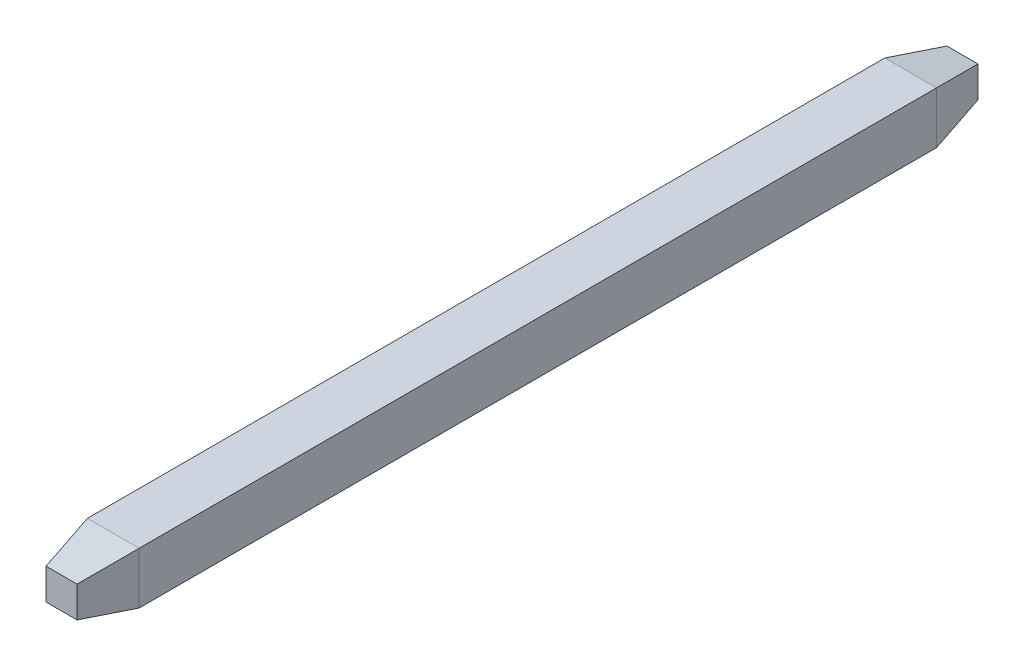
ISO-10303-21;
HEADER;
FILE_DESCRIPTION(('STEP AP214'),'2;1');
FILE_NAME('part.step','',(''),(''),'','','');
FILE_SCHEMA(('AUTOMOTIVE_DESIGN { 1 0 10303 214 1 1 1 1 }'));
ENDSEC;
DATA;
#1=APPLICATION_CONTEXT('core data for automotive mechanical design processes');
#2=APPLICATION_PROTOCOL_DEFINITION('international standard','automotive_design',2000,#1);
#3=PRODUCT_CONTEXT('',#1,'mechanical');
#4=PRODUCT('Part','Part','',(#3));
#5=PRODUCT_RELATED_PRODUCT_CATEGORY('part','',(#4));
#6=PRODUCT_DEFINITION_FORMATION('','',#4);
#7=PRODUCT_DEFINITION_CONTEXT('part definition',#1,'design');
#8=PRODUCT_DEFINITION('design','',#6,#7);
#9=PRODUCT_DEFINITION_SHAPE('','',#8);
#10=(LENGTH_UNIT() NAMED_UNIT(*) SI_UNIT(.MILLI.,.METRE.));
#11=(NAMED_UNIT(*) PLANE_ANGLE_UNIT() SI_UNIT($,.RADIAN.));
#12=(NAMED_UNIT(*) SI_UNIT($,.STERADIAN.) SOLID_ANGLE_UNIT());
#13=UNCERTAINTY_MEASURE_WITH_UNIT(LENGTH_MEASURE(1.E-05),#10,'distance_accuracy_value','');
#14=(GEOMETRIC_REPRESENTATION_CONTEXT(3) GLOBAL_UNCERTAINTY_ASSIGNED_CONTEXT((#13)) GLOBAL_UNIT_ASSIGNED_CONTEXT((#10,
#11,#12)) REPRESENTATION_CONTEXT('',''));
#15=CARTESIAN_POINT('',(0.,0.,0.));
#16=DIRECTION('',(0.,0.,1.));
#17=DIRECTION('',(1.,0.,0.));
#18=AXIS2_PLACEMENT_3D('',#15,#16,#17);
#19=CARTESIAN_POINT('',(4.84,144.16,6.01));
#20=DIRECTION('',(0.,0.,1.));
#21=DIRECTION('',(1.,0.,0.));
#22=AXIS2_PLACEMENT_3D('',#19,#20,#21);
#23=PLANE('',#22);
#24=CARTESIAN_POINT('',(4.15,145.15,6.01));
#25=CARTESIAN_POINT('',(4.15,144.85,6.01));
#26=B_SPLINE_CURVE_WITH_KNOTS('',1,(#24,#25),.UNSPECIFIED.,.F.,.F.,(2,2),(-0.3,0.),.UNSPECIFIED.);
#27=CARTESIAN_POINT('',(4.15,145.15,6.01));
#28=VERTEX_POINT('',#27);
#29=CARTESIAN_POINT('',(4.15,144.85,6.01));
#30=VERTEX_POINT('',#29);
#31=EDGE_CURVE('E11',#28,#30,#26,.T.);
#32=ORIENTED_EDGE('',*,*,#31,.F.);
#33=CARTESIAN_POINT('',(3.85,145.15,6.01));
#34=CARTESIAN_POINT('',(4.15,145.15,6.01));
#35=B_SPLINE_CURVE_WITH_KNOTS('',1,(#33,#34),.UNSPECIFIED.,.F.,.F.,(2,2),(-0.3,0.),.UNSPECIFIED.);
#36=CARTESIAN_POINT('',(3.85,145.15,6.01));
#37=VERTEX_POINT('',#36);
#38=EDGE_CURVE('E26',#37,#28,#35,.T.);
#39=ORIENTED_EDGE('',*,*,#38,.F.);
#40=CARTESIAN_POINT('',(3.85,144.85,6.01));
#41=CARTESIAN_POINT('',(3.85,145.15,6.01));
#42=B_SPLINE_CURVE_WITH_KNOTS('',1,(#40,#41),.UNSPECIFIED.,.F.,.F.,(2,2),(-0.3,0.),.UNSPECIFIED.);
#43=CARTESIAN_POINT('',(3.85,144.85,6.01));
#44=VERTEX_POINT('',#43);
#45=EDGE_CURVE('E263',#44,#37,#42,.T.);
#46=ORIENTED_EDGE('',*,*,#45,.F.);
#47=CARTESIAN_POINT('',(4.15,144.85,6.01));
#48=CARTESIAN_POINT('',(3.85,144.85,6.01));
#49=B_SPLINE_CURVE_WITH_KNOTS('',1,(#47,#48),.UNSPECIFIED.,.F.,.F.,(2,2),(-0.3,0.),.UNSPECIFIED.);
#50=EDGE_CURVE('E255',#30,#44,#49,.T.);
#51=ORIENTED_EDGE('',*,*,#50,.F.);
#52=EDGE_LOOP('',(#32,#39,#46,#51));
#53=FACE_BOUND('',#52,.T.);
#54=ADVANCED_FACE('F17',(#53),#23,.T.);
#55=CARTESIAN_POINT('',(3.75,144.04,6.34));
#56=DIRECTION('',(-1.,0.,0.));
#57=DIRECTION('',(0.,0.,-1.));
#58=AXIS2_PLACEMENT_3D('',#55,#56,#57);
#59=PLANE('',#58);
#60=CARTESIAN_POINT('',(3.75,145.25,5.51));
#61=CARTESIAN_POINT('',(3.75,144.75,5.51));
#62=B_SPLINE_CURVE_WITH_KNOTS('',1,(#60,#61),.UNSPECIFIED.,.F.,.F.,(2,2),(-0.5,0.),.UNSPECIFIED.);
#63=CARTESIAN_POINT('',(3.75,145.25,5.51));
#64=VERTEX_POINT('',#63);
#65=CARTESIAN_POINT('',(3.75,144.75,5.51));
#66=VERTEX_POINT('',#65);
#67=EDGE_CURVE('E248',#64,#66,#62,.T.);
#68=ORIENTED_EDGE('',*,*,#67,.F.);
#69=CARTESIAN_POINT('',(3.75,145.25,-2.19));
#70=CARTESIAN_POINT('',(3.75,145.25,5.51));
#71=B_SPLINE_CURVE_WITH_KNOTS('',1,(#69,#70),.UNSPECIFIED.,.F.,.F.,(2,2),(-7.7,0.),.UNSPECIFIED.);
#72=CARTESIAN_POINT('',(3.75,145.25,-2.19));
#73=VERTEX_POINT('',#72);
#74=EDGE_CURVE('E241',#73,#64,#71,.T.);
#75=ORIENTED_EDGE('',*,*,#74,.F.);
#76=CARTESIAN_POINT('',(3.75,144.75,-2.19));
#77=CARTESIAN_POINT('',(3.75,145.25,-2.19));
#78=B_SPLINE_CURVE_WITH_KNOTS('',1,(#76,#77),.UNSPECIFIED.,.F.,.F.,(2,2),(-0.5,0.),.UNSPECIFIED.);
#79=CARTESIAN_POINT('',(3.75,144.75,-2.19));
#80=VERTEX_POINT('',#79);
#81=EDGE_CURVE('E233',#80,#73,#78,.T.);
#82=ORIENTED_EDGE('',*,*,#81,.F.);
#83=CARTESIAN_POINT('',(3.75,144.75,5.51));
#84=CARTESIAN_POINT('',(3.75,144.75,-2.19));
#85=B_SPLINE_CURVE_WITH_KNOTS('',1,(#83,#84),.UNSPECIFIED.,.F.,.F.,(2,2),(-7.7,0.),.UNSPECIFIED.);
#86=EDGE_CURVE('E225',#66,#80,#85,.T.);
#87=ORIENTED_EDGE('',*,*,#86,.F.);
#88=EDGE_LOOP('',(#68,#75,#82,#87));
#89=FACE_BOUND('',#88,.T.);
#90=ADVANCED_FACE('F319',(#89),#59,.T.);
#91=CARTESIAN_POINT('',(3.16,144.16,-2.69));
#92=DIRECTION('',(0.,0.,-1.));
#93=DIRECTION('',(-1.,0.,0.));
#94=AXIS2_PLACEMENT_3D('',#91,#92,#93);
#95=PLANE('',#94);
#96=CARTESIAN_POINT('',(4.15,144.85,-2.69));
#97=CARTESIAN_POINT('',(4.15,145.15,-2.69));
#98=B_SPLINE_CURVE_WITH_KNOTS('',1,(#96,#97),.UNSPECIFIED.,.F.,.F.,(2,2),(-0.3,0.),.UNSPECIFIED.);
#99=CARTESIAN_POINT('',(4.15,144.85,-2.69));
#100=VERTEX_POINT('',#99);
#101=CARTESIAN_POINT('',(4.15,145.15,-2.69));
#102=VERTEX_POINT('',#101);
#103=EDGE_CURVE('E114',#100,#102,#98,.T.);
#104=ORIENTED_EDGE('',*,*,#103,.F.);
#105=CARTESIAN_POINT('',(3.85,144.85,-2.69));
#106=CARTESIAN_POINT('',(4.15,144.85,-2.69));
#107=B_SPLINE_CURVE_WITH_KNOTS('',1,(#105,#106),.UNSPECIFIED.,.F.,.F.,(2,2),(-0.3,0.),.UNSPECIFIED.);
#108=CARTESIAN_POINT('',(3.85,144.85,-2.69));
#109=VERTEX_POINT('',#108);
#110=EDGE_CURVE('E211',#109,#100,#107,.T.);
#111=ORIENTED_EDGE('',*,*,#110,.F.);
#112=CARTESIAN_POINT('',(3.85,145.15,-2.69));
#113=CARTESIAN_POINT('',(3.85,144.85,-2.69));
#114=B_SPLINE_CURVE_WITH_KNOTS('',1,(#112,#113),.UNSPECIFIED.,.F.,.F.,(2,2),(-0.3,0.),.UNSPECIFIED.);
#115=CARTESIAN_POINT('',(3.85,145.15,-2.69));
#116=VERTEX_POINT('',#115);
#117=EDGE_CURVE('E203',#116,#109,#114,.T.);
#118=ORIENTED_EDGE('',*,*,#117,.F.);
#119=CARTESIAN_POINT('',(4.15,145.15,-2.69));
#120=CARTESIAN_POINT('',(3.85,145.15,-2.69));
#121=B_SPLINE_CURVE_WITH_KNOTS('',1,(#119,#120),.UNSPECIFIED.,.F.,.F.,(2,2),(-0.3,0.),.UNSPECIFIED.);
#122=EDGE_CURVE('E196',#102,#116,#121,.T.);
#123=ORIENTED_EDGE('',*,*,#122,.F.);
#124=EDGE_LOOP('',(#104,#111,#118,#123));
#125=FACE_BOUND('',#124,.T.);
#126=ADVANCED_FACE('F315',(#125),#95,.T.);
#127=CARTESIAN_POINT('',(4.25,144.04,-3.02));
#128=DIRECTION('',(1.,0.,0.));
#129=DIRECTION('',(0.,0.,1.));
#130=AXIS2_PLACEMENT_3D('',#127,#128,#129);
#131=PLANE('',#130);
#132=CARTESIAN_POINT('',(4.25,144.75,5.51));
#133=CARTESIAN_POINT('',(4.25,145.25,5.51));
#134=B_SPLINE_CURVE_WITH_KNOTS('',1,(#132,#133),.UNSPECIFIED.,.F.,.F.,(2,2),(-0.5,0.),.UNSPECIFIED.);
#135=CARTESIAN_POINT('',(4.25,144.75,5.51));
#136=VERTEX_POINT('',#135);
#137=CARTESIAN_POINT('',(4.25,145.25,5.51));
#138=VERTEX_POINT('',#137);
#139=EDGE_CURVE('E189',#136,#138,#134,.T.);
#140=ORIENTED_EDGE('',*,*,#139,.F.);
#141=CARTESIAN_POINT('',(4.25,144.75,-2.19));
#142=CARTESIAN_POINT('',(4.25,144.75,5.51));
#143=B_SPLINE_CURVE_WITH_KNOTS('',1,(#141,#142),.UNSPECIFIED.,.F.,.F.,(2,2),(-7.7,0.),.UNSPECIFIED.);
#144=CARTESIAN_POINT('',(4.25,144.75,-2.19));
#145=VERTEX_POINT('',#144);
#146=EDGE_CURVE('E86',#145,#136,#143,.T.);
#147=ORIENTED_EDGE('',*,*,#146,.F.);
#148=CARTESIAN_POINT('',(4.25,145.25,-2.19));
#149=CARTESIAN_POINT('',(4.25,144.75,-2.19));
#150=B_SPLINE_CURVE_WITH_KNOTS('',1,(#148,#149),.UNSPECIFIED.,.F.,.F.,(2,2),(-0.5,0.),.UNSPECIFIED.);
#151=CARTESIAN_POINT('',(4.25,145.25,-2.19));
#152=VERTEX_POINT('',#151);
#153=EDGE_CURVE('E80',#152,#145,#150,.T.);
#154=ORIENTED_EDGE('',*,*,#153,.F.);
#155=CARTESIAN_POINT('',(4.25,145.25,5.51));
#156=CARTESIAN_POINT('',(4.25,145.25,-2.19));
#157=B_SPLINE_CURVE_WITH_KNOTS('',1,(#155,#156),.UNSPECIFIED.,.F.,.F.,(2,2),(-7.7,0.),.UNSPECIFIED.);
#158=EDGE_CURVE('E83',#138,#152,#157,.T.);
#159=ORIENTED_EDGE('',*,*,#158,.F.);
#160=EDGE_LOOP('',(#140,#147,#154,#159));
#161=FACE_BOUND('',#160,.T.);
#162=ADVANCED_FACE('F82',(#161),#131,.T.);
#163=CARTESIAN_POINT('',(3.04,144.75,6.34));
#164=DIRECTION('',(0.,-1.,0.));
#165=DIRECTION('',(0.,0.,-1.));
#166=AXIS2_PLACEMENT_3D('',#163,#164,#165);
#167=PLANE('',#166);
#168=ORIENTED_EDGE('',*,*,#146,.T.);
#169=CARTESIAN_POINT('',(4.25,144.75,5.51));
#170=CARTESIAN_POINT('',(3.75,144.75,5.51));
#171=B_SPLINE_CURVE_WITH_KNOTS('',1,(#169,#170),.UNSPECIFIED.,.F.,.F.,(2,2),(0.,0.5),.UNSPECIFIED.);
#172=EDGE_CURVE('E102',#136,#66,#171,.T.);
#173=ORIENTED_EDGE('',*,*,#172,.T.);
#174=ORIENTED_EDGE('',*,*,#86,.T.);
#175=CARTESIAN_POINT('',(3.75,144.75,-2.19));
#176=CARTESIAN_POINT('',(4.25,144.75,-2.19));
#177=B_SPLINE_CURVE_WITH_KNOTS('',1,(#175,#176),.UNSPECIFIED.,.F.,.F.,(2,2),(0.,0.5),.UNSPECIFIED.);
#178=EDGE_CURVE('E159',#80,#145,#177,.T.);
#179=ORIENTED_EDGE('',*,*,#178,.T.);
#180=EDGE_LOOP('',(#168,#173,#174,#179));
#181=FACE_BOUND('',#180,.T.);
#182=ADVANCED_FACE('F308',(#181),#167,.T.);
#183=CARTESIAN_POINT('',(3.04,145.25,6.34));
#184=DIRECTION('',(0.,1.,0.));
#185=DIRECTION('',(0.,0.,1.));
#186=AXIS2_PLACEMENT_3D('',#183,#184,#185);
#187=PLANE('',#186);
#188=CARTESIAN_POINT('',(4.25,145.25,5.51));
#189=CARTESIAN_POINT('',(3.75,145.25,5.51));
#190=B_SPLINE_CURVE_WITH_KNOTS('',1,(#188,#189),.UNSPECIFIED.,.F.,.F.,(2,2),(-0.5,0.),.UNSPECIFIED.);
#191=EDGE_CURVE('E100',#138,#64,#190,.T.);
#192=ORIENTED_EDGE('',*,*,#191,.F.);
#193=ORIENTED_EDGE('',*,*,#158,.T.);
#194=CARTESIAN_POINT('',(3.75,145.25,-2.19));
#195=CARTESIAN_POINT('',(4.25,145.25,-2.19));
#196=B_SPLINE_CURVE_WITH_KNOTS('',1,(#194,#195),.UNSPECIFIED.,.F.,.F.,(2,2),(-0.5,0.),.UNSPECIFIED.);
#197=EDGE_CURVE('E97',#73,#152,#196,.T.);
#198=ORIENTED_EDGE('',*,*,#197,.F.);
#199=ORIENTED_EDGE('',*,*,#74,.T.);
#200=EDGE_LOOP('',(#192,#193,#198,#199));
#201=FACE_BOUND('',#200,.T.);
#202=ADVANCED_FACE('F95',(#201),#187,.T.);
#203=CARTESIAN_POINT('',(3.99151583492906,144.04,-3.39757917464532));
#204=DIRECTION('',(-0.98058067569092,0.,-0.196116135138184));
#205=DIRECTION('',(0.196116135138184,0.,-0.98058067569092));
#206=AXIS2_PLACEMENT_3D('',#203,#204,#205);
#207=PLANE('',#206);
#208=ORIENTED_EDGE('',*,*,#117,.T.);
#209=CARTESIAN_POINT('',(3.75,144.75,-2.19));
#210=CARTESIAN_POINT('',(3.85,144.85,-2.69));
#211=B_SPLINE_CURVE_WITH_KNOTS('',1,(#209,#210),.UNSPECIFIED.,.F.,.F.,(2,2),(-0.519615242270663,
0.),.UNSPECIFIED.);
#212=EDGE_CURVE('E111',#80,#109,#211,.T.);
#213=ORIENTED_EDGE('',*,*,#212,.F.);
#214=ORIENTED_EDGE('',*,*,#81,.T.);
#215=CARTESIAN_POINT('',(3.85,145.15,-2.69));
#216=CARTESIAN_POINT('',(3.75,145.25,-2.19));
#217=B_SPLINE_CURVE_WITH_KNOTS('',1,(#215,#216),.UNSPECIFIED.,.F.,.F.,(2,2),(-0.519615242270663,
0.),.UNSPECIFIED.);
#218=EDGE_CURVE('E110',#116,#73,#217,.T.);
#219=ORIENTED_EDGE('',*,*,#218,.F.);
#220=EDGE_LOOP('',(#208,#213,#214,#219));
#221=FACE_BOUND('',#220,.T.);
#222=ADVANCED_FACE('F317',(#221),#207,.T.);
#223=CARTESIAN_POINT('',(4.96,144.608484165071,-1.48242082535468));
#224=DIRECTION('',(0.,-0.98058067569092,-0.196116135138183));
#225=DIRECTION('',(0.,0.196116135138183,-0.98058067569092));
#226=AXIS2_PLACEMENT_3D('',#223,#224,#225);
#227=PLANE('',#226);
#228=ORIENTED_EDGE('',*,*,#212,.T.);
#229=ORIENTED_EDGE('',*,*,#110,.T.);
#230=CARTESIAN_POINT('',(4.15,144.85,-2.69));
#231=CARTESIAN_POINT('',(4.25,144.75,-2.19));
#232=B_SPLINE_CURVE_WITH_KNOTS('',1,(#230,#231),.UNSPECIFIED.,.F.,.F.,(2,2),(0.,
0.519615242270663),.UNSPECIFIED.);
#233=EDGE_CURVE('E116',#100,#145,#232,.T.);
#234=ORIENTED_EDGE('',*,*,#233,.T.);
#235=ORIENTED_EDGE('',*,*,#178,.F.);
#236=EDGE_LOOP('',(#228,#229,#234,#235));
#237=FACE_BOUND('',#236,.T.);
#238=ADVANCED_FACE('F313',(#237),#227,.T.);
#239=CARTESIAN_POINT('',(3.04,145.008484165071,-3.39757917464532));
#240=DIRECTION('',(0.,0.98058067569092,-0.196116135138183));
#241=DIRECTION('',(0.,0.196116135138183,0.98058067569092));
#242=AXIS2_PLACEMENT_3D('',#239,#240,#241);
#243=PLANE('',#242);
#244=ORIENTED_EDGE('',*,*,#197,.T.);
#245=CARTESIAN_POINT('',(4.15,145.15,-2.69));
#246=CARTESIAN_POINT('',(4.25,145.25,-2.19));
#247=B_SPLINE_CURVE_WITH_KNOTS('',1,(#245,#246),.UNSPECIFIED.,.F.,.F.,(2,2),(-0.519615242270663,
0.),.UNSPECIFIED.);
#248=EDGE_CURVE('E108',#102,#152,#247,.T.);
#249=ORIENTED_EDGE('',*,*,#248,.F.);
#250=ORIENTED_EDGE('',*,*,#122,.T.);
#251=ORIENTED_EDGE('',*,*,#218,.T.);
#252=EDGE_LOOP('',(#244,#249,#250,#251));
#253=FACE_BOUND('',#252,.T.);
#254=ADVANCED_FACE('F106',(#253),#243,.T.);
#255=CARTESIAN_POINT('',(4.39151583492906,144.04,-1.48242082535468));
#256=DIRECTION('',(0.98058067569092,0.,-0.196116135138184));
#257=DIRECTION('',(0.196116135138184,0.,0.98058067569092));
#258=AXIS2_PLACEMENT_3D('',#255,#256,#257);
#259=PLANE('',#258);
#260=ORIENTED_EDGE('',*,*,#103,.T.);
#261=ORIENTED_EDGE('',*,*,#248,.T.);
#262=ORIENTED_EDGE('',*,*,#153,.T.);
#263=ORIENTED_EDGE('',*,*,#233,.F.);
#264=EDGE_LOOP('',(#260,#261,#262,#263));
#265=FACE_BOUND('',#264,.T.);
#266=ADVANCED_FACE('F113',(#265),#259,.T.);
#267=CARTESIAN_POINT('',(3.60848416507094,144.04,4.80242082535468));
#268=DIRECTION('',(-0.98058067569092,0.,0.196116135138184));
#269=DIRECTION('',(-0.196116135138184,0.,-0.98058067569092));
#270=AXIS2_PLACEMENT_3D('',#267,#268,#269);
#271=PLANE('',#270);
#272=ORIENTED_EDGE('',*,*,#67,.T.);
#273=CARTESIAN_POINT('',(3.85,144.85,6.01));
#274=CARTESIAN_POINT('',(3.75,144.75,5.51));
#275=B_SPLINE_CURVE_WITH_KNOTS('',1,(#273,#274),.UNSPECIFIED.,.F.,.F.,(2,2),(-0.519615242270663,
0.),.UNSPECIFIED.);
#276=EDGE_CURVE('E117',#44,#66,#275,.T.);
#277=ORIENTED_EDGE('',*,*,#276,.F.);
#278=ORIENTED_EDGE('',*,*,#45,.T.);
#279=CARTESIAN_POINT('',(3.75,145.25,5.51));
#280=CARTESIAN_POINT('',(3.85,145.15,6.01));
#281=B_SPLINE_CURVE_WITH_KNOTS('',1,(#279,#280),.UNSPECIFIED.,.F.,.F.,(2,2),(-0.519615242270663,
0.),.UNSPECIFIED.);
#282=EDGE_CURVE('E122',#64,#37,#281,.T.);
#283=ORIENTED_EDGE('',*,*,#282,.F.);
#284=EDGE_LOOP('',(#272,#277,#278,#283));
#285=FACE_BOUND('',#284,.T.);
#286=ADVANCED_FACE('F321',(#285),#271,.T.);
#287=CARTESIAN_POINT('',(3.04,144.608484165071,4.80242082535468));
#288=DIRECTION('',(0.,-0.98058067569092,0.196116135138183));
#289=DIRECTION('',(0.,-0.196116135138183,-0.98058067569092));
#290=AXIS2_PLACEMENT_3D('',#287,#288,#289);
#291=PLANE('',#290);
#292=ORIENTED_EDGE('',*,*,#276,.T.);
#293=ORIENTED_EDGE('',*,*,#172,.F.);
#294=CARTESIAN_POINT('',(4.25,144.75,5.51));
#295=CARTESIAN_POINT('',(4.15,144.85,6.01));
#296=B_SPLINE_CURVE_WITH_KNOTS('',1,(#294,#295),.UNSPECIFIED.,.F.,.F.,(2,2),(0.,
0.519615242270663),.UNSPECIFIED.);
#297=EDGE_CURVE('E284',#136,#30,#296,.T.);
#298=ORIENTED_EDGE('',*,*,#297,.T.);
#299=ORIENTED_EDGE('',*,*,#50,.T.);
#300=EDGE_LOOP('',(#292,#293,#298,#299));
#301=FACE_BOUND('',#300,.T.);
#302=ADVANCED_FACE('F305',(#301),#291,.T.);
#303=CARTESIAN_POINT('',(4.96,145.008484165071,6.71757917464532));
#304=DIRECTION('',(0.,0.98058067569092,0.196116135138183));
#305=DIRECTION('',(0.,-0.196116135138183,0.98058067569092));
#306=AXIS2_PLACEMENT_3D('',#303,#304,#305);
#307=PLANE('',#306);
#308=ORIENTED_EDGE('',*,*,#38,.T.);
#309=CARTESIAN_POINT('',(4.25,145.25,5.51));
#310=CARTESIAN_POINT('',(4.15,145.15,6.01));
#311=B_SPLINE_CURVE_WITH_KNOTS('',1,(#309,#310),.UNSPECIFIED.,.F.,.F.,(2,2),(-0.519615242270663,
0.),.UNSPECIFIED.);
#312=EDGE_CURVE('E281',#138,#28,#311,.T.);
#313=ORIENTED_EDGE('',*,*,#312,.F.);
#314=ORIENTED_EDGE('',*,*,#191,.T.);
#315=ORIENTED_EDGE('',*,*,#282,.T.);
#316=EDGE_LOOP('',(#308,#313,#314,#315));
#317=FACE_BOUND('',#316,.T.);
#318=ADVANCED_FACE('F280',(#317),#307,.T.);
#319=CARTESIAN_POINT('',(4.00848416507094,144.04,6.71757917464532));
#320=DIRECTION('',(0.98058067569092,0.,0.196116135138184));
#321=DIRECTION('',(-0.196116135138184,0.,0.98058067569092));
#322=AXIS2_PLACEMENT_3D('',#319,#320,#321);
#323=PLANE('',#322);
#324=ORIENTED_EDGE('',*,*,#139,.T.);
#325=ORIENTED_EDGE('',*,*,#312,.T.);
#326=ORIENTED_EDGE('',*,*,#31,.T.);
#327=ORIENTED_EDGE('',*,*,#297,.F.);
#328=EDGE_LOOP('',(#324,#325,#326,#327));
#329=FACE_BOUND('',#328,.T.);
#330=ADVANCED_FACE('F283',(#329),#323,.T.);
#331=CLOSED_SHELL('',(#54,#90,#126,#162,#182,#202,#222,#238,#254,#266,#286,#302,#318,#330));
#332=MANIFOLD_SOLID_BREP('B1',#331);
#333=ADVANCED_BREP_SHAPE_REPRESENTATION('',(#18,#332),#14);
#334=SHAPE_DEFINITION_REPRESENTATION(#9,#333);
ENDSEC;
END-ISO-10303-21;
